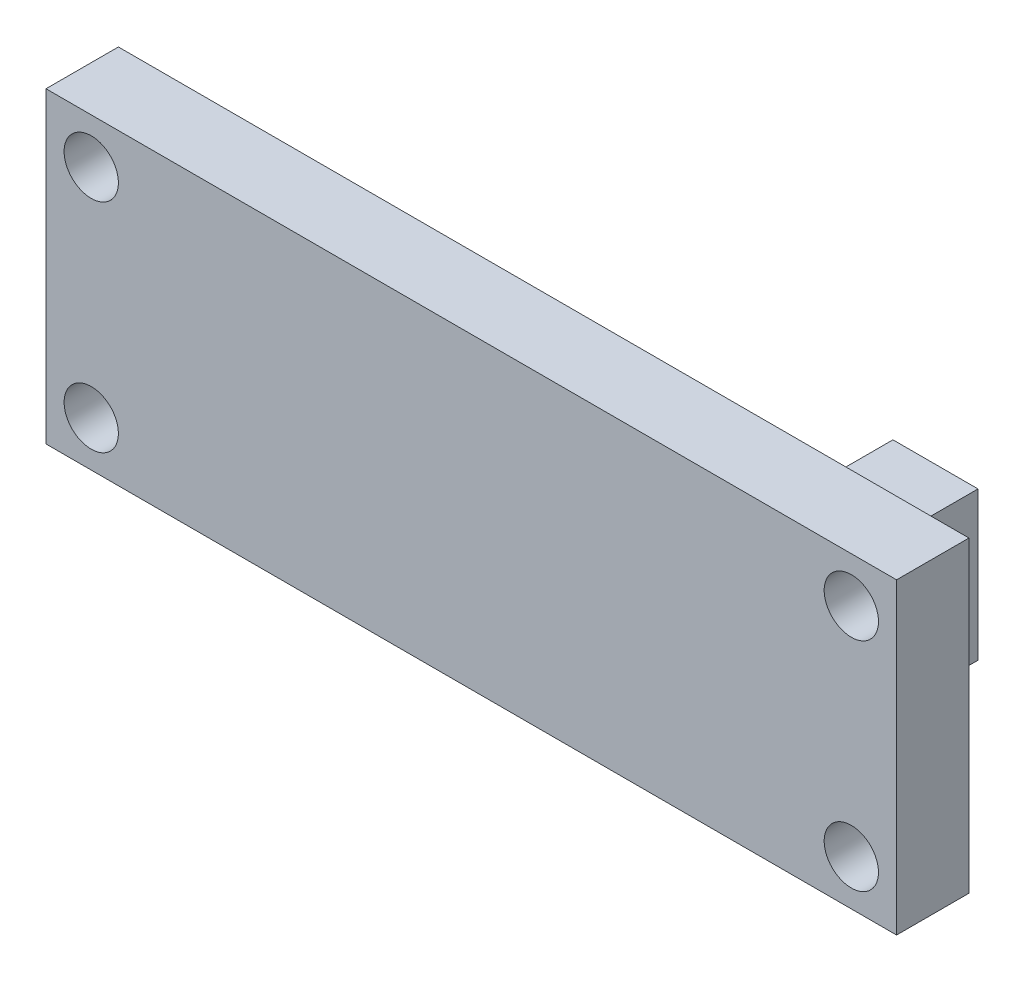
ISO-10303-21;
HEADER;
FILE_DESCRIPTION(('STEP AP214'),'2;1');
FILE_NAME('part.step','',(''),(''),'','','');
FILE_SCHEMA(('AUTOMOTIVE_DESIGN { 1 0 10303 214 1 1 1 1 }'));
ENDSEC;
DATA;
#1=APPLICATION_CONTEXT('core data for automotive mechanical design processes');
#2=APPLICATION_PROTOCOL_DEFINITION('international standard','automotive_design',2000,#1);
#3=PRODUCT_CONTEXT('',#1,'mechanical');
#4=PRODUCT('Part','Part','',(#3));
#5=PRODUCT_RELATED_PRODUCT_CATEGORY('part','',(#4));
#6=PRODUCT_DEFINITION_FORMATION('','',#4);
#7=PRODUCT_DEFINITION_CONTEXT('part definition',#1,'design');
#8=PRODUCT_DEFINITION('design','',#6,#7);
#9=PRODUCT_DEFINITION_SHAPE('','',#8);
#10=(LENGTH_UNIT() NAMED_UNIT(*) SI_UNIT(.MILLI.,.METRE.));
#11=(NAMED_UNIT(*) PLANE_ANGLE_UNIT() SI_UNIT($,.RADIAN.));
#12=(NAMED_UNIT(*) SI_UNIT($,.STERADIAN.) SOLID_ANGLE_UNIT());
#13=UNCERTAINTY_MEASURE_WITH_UNIT(LENGTH_MEASURE(1.E-05),#10,'distance_accuracy_value','');
#14=(GEOMETRIC_REPRESENTATION_CONTEXT(3) GLOBAL_UNCERTAINTY_ASSIGNED_CONTEXT((#13)) GLOBAL_UNIT_ASSIGNED_CONTEXT((#10,
#11,#12)) REPRESENTATION_CONTEXT('',''));
#15=CARTESIAN_POINT('',(0.,0.,0.));
#16=DIRECTION('',(0.,0.,1.));
#17=DIRECTION('',(1.,0.,0.));
#18=AXIS2_PLACEMENT_3D('',#15,#16,#17);
#19=CARTESIAN_POINT('',(0.,0.,0.));
#20=DIRECTION('',(0.,0.,1.));
#21=DIRECTION('',(1.,0.,0.));
#22=AXIS2_PLACEMENT_3D('',#19,#20,#21);
#23=PLANE('',#22);
#24=DIRECTION('',(0.,-1.,0.));
#25=VECTOR('',#24,1.);
#26=CARTESIAN_POINT('',(-47.,17.,0.));
#27=LINE('',#26,#25);
#28=CARTESIAN_POINT('',(-47.,17.,0.));
#29=VERTEX_POINT('',#28);
#30=CARTESIAN_POINT('',(-47.,0.,0.));
#31=VERTEX_POINT('',#30);
#32=EDGE_CURVE('E145',#29,#31,#27,.T.);
#33=ORIENTED_EDGE('',*,*,#32,.F.);
#34=DIRECTION('',(-1.,0.,0.));
#35=VECTOR('',#34,1.);
#36=CARTESIAN_POINT('',(-47.,17.,0.));
#37=LINE('',#36,#35);
#38=CARTESIAN_POINT('',(0.,17.,0.));
#39=VERTEX_POINT('',#38);
#40=EDGE_CURVE('E152',#39,#29,#37,.T.);
#41=ORIENTED_EDGE('',*,*,#40,.F.);
#42=DIRECTION('',(0.,1.,0.));
#43=VECTOR('',#42,1.);
#44=CARTESIAN_POINT('',(0.,17.,0.));
#45=LINE('',#44,#43);
#46=CARTESIAN_POINT('',(0.,0.,0.));
#47=VERTEX_POINT('',#46);
#48=EDGE_CURVE('E163',#47,#39,#45,.T.);
#49=ORIENTED_EDGE('',*,*,#48,.F.);
#50=DIRECTION('',(1.,0.,0.));
#51=VECTOR('',#50,1.);
#52=CARTESIAN_POINT('',(-47.,0.,0.));
#53=LINE('',#52,#51);
#54=EDGE_CURVE('E161',#31,#47,#53,.T.);
#55=ORIENTED_EDGE('',*,*,#54,.F.);
#56=EDGE_LOOP('',(#33,#41,#49,#55));
#57=FACE_BOUND('',#56,.T.);
#58=CARTESIAN_POINT('',(-2.5,14.5,0.));
#59=DIRECTION('',(0.,0.,1.));
#60=DIRECTION('',(1.,0.,0.));
#61=AXIS2_PLACEMENT_3D('',#58,#59,#60);
#62=CIRCLE('',#61,1.5);
#63=CARTESIAN_POINT('',(-1.,14.5,0.));
#64=VERTEX_POINT('',#63);
#65=EDGE_CURVE('E142',#64,#64,#62,.T.);
#66=ORIENTED_EDGE('',*,*,#65,.T.);
#67=EDGE_LOOP('',(#66));
#68=FACE_BOUND('',#67,.T.);
#69=CARTESIAN_POINT('',(-44.5,2.5,0.));
#70=DIRECTION('',(0.,0.,1.));
#71=DIRECTION('',(1.,0.,0.));
#72=AXIS2_PLACEMENT_3D('',#69,#70,#71);
#73=CIRCLE('',#72,1.5);
#74=CARTESIAN_POINT('',(-43.,2.5,0.));
#75=VERTEX_POINT('',#74);
#76=EDGE_CURVE('E121',#75,#75,#73,.T.);
#77=ORIENTED_EDGE('',*,*,#76,.T.);
#78=EDGE_LOOP('',(#77));
#79=FACE_BOUND('',#78,.T.);
#80=CARTESIAN_POINT('',(-44.5,14.5,0.));
#81=DIRECTION('',(0.,0.,1.));
#82=DIRECTION('',(1.,0.,0.));
#83=AXIS2_PLACEMENT_3D('',#80,#81,#82);
#84=CIRCLE('',#83,1.5);
#85=CARTESIAN_POINT('',(-43.,14.5,0.));
#86=VERTEX_POINT('',#85);
#87=EDGE_CURVE('E137',#86,#86,#84,.T.);
#88=ORIENTED_EDGE('',*,*,#87,.T.);
#89=EDGE_LOOP('',(#88));
#90=FACE_BOUND('',#89,.T.);
#91=CARTESIAN_POINT('',(-2.5,2.5,0.));
#92=DIRECTION('',(0.,0.,1.));
#93=DIRECTION('',(1.,0.,0.));
#94=AXIS2_PLACEMENT_3D('',#91,#92,#93);
#95=CIRCLE('',#94,1.5);
#96=CARTESIAN_POINT('',(-1.,2.5,0.));
#97=VERTEX_POINT('',#96);
#98=EDGE_CURVE('E130',#97,#97,#95,.T.);
#99=ORIENTED_EDGE('',*,*,#98,.T.);
#100=EDGE_LOOP('',(#99));
#101=FACE_BOUND('',#100,.T.);
#102=DIRECTION('',(0.,-1.,0.));
#103=VECTOR('',#102,1.);
#104=CARTESIAN_POINT('',(-6.5,12.6,0.));
#105=LINE('',#104,#103);
#106=CARTESIAN_POINT('',(-6.5,12.6,0.));
#107=VERTEX_POINT('',#106);
#108=CARTESIAN_POINT('',(-6.5,4.4,0.));
#109=VERTEX_POINT('',#108);
#110=EDGE_CURVE('E117',#107,#109,#105,.T.);
#111=ORIENTED_EDGE('',*,*,#110,.F.);
#112=DIRECTION('',(1.,0.,0.));
#113=VECTOR('',#112,1.);
#114=CARTESIAN_POINT('',(-6.5,12.6,0.));
#115=LINE('',#114,#113);
#116=CARTESIAN_POINT('',(-11.2,12.6,0.));
#117=VERTEX_POINT('',#116);
#118=EDGE_CURVE('E114',#117,#107,#115,.T.);
#119=ORIENTED_EDGE('',*,*,#118,.F.);
#120=DIRECTION('',(0.,1.,0.));
#121=VECTOR('',#120,1.);
#122=CARTESIAN_POINT('',(-11.2,12.6,0.));
#123=LINE('',#122,#121);
#124=CARTESIAN_POINT('',(-11.2,4.4,0.));
#125=VERTEX_POINT('',#124);
#126=EDGE_CURVE('E52',#125,#117,#123,.T.);
#127=ORIENTED_EDGE('',*,*,#126,.F.);
#128=DIRECTION('',(-1.,0.,0.));
#129=VECTOR('',#128,1.);
#130=CARTESIAN_POINT('',(-6.5,4.4,0.));
#131=LINE('',#130,#129);
#132=EDGE_CURVE('E47',#109,#125,#131,.T.);
#133=ORIENTED_EDGE('',*,*,#132,.F.);
#134=EDGE_LOOP('',(#111,#119,#127,#133));
#135=FACE_BOUND('',#134,.T.);
#136=ADVANCED_FACE('F32',(#57,#68,#79,#90,#101,#135),#23,.F.);
#137=CARTESIAN_POINT('',(-47.,17.,4.));
#138=DIRECTION('',(1.,0.,0.));
#139=DIRECTION('',(0.,0.,-1.));
#140=AXIS2_PLACEMENT_3D('',#137,#138,#139);
#141=PLANE('',#140);
#142=ORIENTED_EDGE('',*,*,#32,.T.);
#143=DIRECTION('',(0.,0.,-1.));
#144=VECTOR('',#143,1.);
#145=CARTESIAN_POINT('',(-47.,0.,4.));
#146=LINE('',#145,#144);
#147=CARTESIAN_POINT('',(-47.,0.,4.));
#148=VERTEX_POINT('',#147);
#149=EDGE_CURVE('E11',#148,#31,#146,.T.);
#150=ORIENTED_EDGE('',*,*,#149,.F.);
#151=DIRECTION('',(0.,-1.,0.));
#152=VECTOR('',#151,1.);
#153=CARTESIAN_POINT('',(-47.,17.,4.));
#154=LINE('',#153,#152);
#155=CARTESIAN_POINT('',(-47.,17.,4.));
#156=VERTEX_POINT('',#155);
#157=EDGE_CURVE('E148',#156,#148,#154,.T.);
#158=ORIENTED_EDGE('',*,*,#157,.F.);
#159=DIRECTION('',(0.,0.,-1.));
#160=VECTOR('',#159,1.);
#161=CARTESIAN_POINT('',(-47.,17.,4.));
#162=LINE('',#161,#160);
#163=EDGE_CURVE('E158',#156,#29,#162,.T.);
#164=ORIENTED_EDGE('',*,*,#163,.T.);
#165=EDGE_LOOP('',(#142,#150,#158,#164));
#166=FACE_BOUND('',#165,.T.);
#167=ADVANCED_FACE('F34',(#166),#141,.F.);
#168=CARTESIAN_POINT('',(-47.,0.,4.));
#169=DIRECTION('',(0.,1.,0.));
#170=DIRECTION('',(-1.,0.,0.));
#171=AXIS2_PLACEMENT_3D('',#168,#169,#170);
#172=PLANE('',#171);
#173=ORIENTED_EDGE('',*,*,#54,.T.);
#174=DIRECTION('',(0.,0.,-1.));
#175=VECTOR('',#174,1.);
#176=CARTESIAN_POINT('',(0.,0.,4.));
#177=LINE('',#176,#175);
#178=CARTESIAN_POINT('',(0.,0.,4.));
#179=VERTEX_POINT('',#178);
#180=EDGE_CURVE('E40',#179,#47,#177,.T.);
#181=ORIENTED_EDGE('',*,*,#180,.F.);
#182=DIRECTION('',(1.,0.,0.));
#183=VECTOR('',#182,1.);
#184=CARTESIAN_POINT('',(-47.,0.,4.));
#185=LINE('',#184,#183);
#186=EDGE_CURVE('E151',#148,#179,#185,.T.);
#187=ORIENTED_EDGE('',*,*,#186,.F.);
#188=ORIENTED_EDGE('',*,*,#149,.T.);
#189=EDGE_LOOP('',(#173,#181,#187,#188));
#190=FACE_BOUND('',#189,.T.);
#191=ADVANCED_FACE('F191',(#190),#172,.F.);
#192=CARTESIAN_POINT('',(0.,17.,4.));
#193=DIRECTION('',(-1.,0.,0.));
#194=DIRECTION('',(0.,-1.,0.));
#195=AXIS2_PLACEMENT_3D('',#192,#193,#194);
#196=PLANE('',#195);
#197=ORIENTED_EDGE('',*,*,#48,.T.);
#198=DIRECTION('',(0.,0.,-1.));
#199=VECTOR('',#198,1.);
#200=CARTESIAN_POINT('',(0.,17.,4.));
#201=LINE('',#200,#199);
#202=CARTESIAN_POINT('',(0.,17.,4.));
#203=VERTEX_POINT('',#202);
#204=EDGE_CURVE('E168',#203,#39,#201,.T.);
#205=ORIENTED_EDGE('',*,*,#204,.F.);
#206=DIRECTION('',(0.,1.,0.));
#207=VECTOR('',#206,1.);
#208=CARTESIAN_POINT('',(0.,17.,4.));
#209=LINE('',#208,#207);
#210=EDGE_CURVE('E154',#179,#203,#209,.T.);
#211=ORIENTED_EDGE('',*,*,#210,.F.);
#212=ORIENTED_EDGE('',*,*,#180,.T.);
#213=EDGE_LOOP('',(#197,#205,#211,#212));
#214=FACE_BOUND('',#213,.T.);
#215=ADVANCED_FACE('F175',(#214),#196,.F.);
#216=CARTESIAN_POINT('',(-47.,17.,4.));
#217=DIRECTION('',(0.,-1.,0.));
#218=DIRECTION('',(0.,0.,-1.));
#219=AXIS2_PLACEMENT_3D('',#216,#217,#218);
#220=PLANE('',#219);
#221=ORIENTED_EDGE('',*,*,#40,.T.);
#222=ORIENTED_EDGE('',*,*,#163,.F.);
#223=DIRECTION('',(-1.,0.,0.));
#224=VECTOR('',#223,1.);
#225=CARTESIAN_POINT('',(-47.,17.,4.));
#226=LINE('',#225,#224);
#227=EDGE_CURVE('E156',#203,#156,#226,.T.);
#228=ORIENTED_EDGE('',*,*,#227,.F.);
#229=ORIENTED_EDGE('',*,*,#204,.T.);
#230=EDGE_LOOP('',(#221,#222,#228,#229));
#231=FACE_BOUND('',#230,.T.);
#232=ADVANCED_FACE('F184',(#231),#220,.F.);
#233=CARTESIAN_POINT('',(0.,0.,4.));
#234=DIRECTION('',(0.,0.,1.));
#235=DIRECTION('',(1.,0.,0.));
#236=AXIS2_PLACEMENT_3D('',#233,#234,#235);
#237=PLANE('',#236);
#238=CARTESIAN_POINT('',(-2.5,2.5,4.));
#239=DIRECTION('',(0.,0.,1.));
#240=DIRECTION('',(1.,0.,0.));
#241=AXIS2_PLACEMENT_3D('',#238,#239,#240);
#242=CIRCLE('',#241,1.5);
#243=CARTESIAN_POINT('',(-1.,2.5,4.));
#244=VERTEX_POINT('',#243);
#245=EDGE_CURVE('E134',#244,#244,#242,.T.);
#246=ORIENTED_EDGE('',*,*,#245,.F.);
#247=EDGE_LOOP('',(#246));
#248=FACE_BOUND('',#247,.T.);
#249=CARTESIAN_POINT('',(-44.5,14.5,4.));
#250=DIRECTION('',(0.,0.,1.));
#251=DIRECTION('',(1.,0.,0.));
#252=AXIS2_PLACEMENT_3D('',#249,#250,#251);
#253=CIRCLE('',#252,1.5);
#254=CARTESIAN_POINT('',(-43.,14.5,4.));
#255=VERTEX_POINT('',#254);
#256=EDGE_CURVE('E128',#255,#255,#253,.T.);
#257=ORIENTED_EDGE('',*,*,#256,.F.);
#258=EDGE_LOOP('',(#257));
#259=FACE_BOUND('',#258,.T.);
#260=CARTESIAN_POINT('',(-44.5,2.5,4.));
#261=DIRECTION('',(0.,0.,1.));
#262=DIRECTION('',(1.,0.,0.));
#263=AXIS2_PLACEMENT_3D('',#260,#261,#262);
#264=CIRCLE('',#263,1.5);
#265=CARTESIAN_POINT('',(-43.,2.5,4.));
#266=VERTEX_POINT('',#265);
#267=EDGE_CURVE('E118',#266,#266,#264,.T.);
#268=ORIENTED_EDGE('',*,*,#267,.F.);
#269=EDGE_LOOP('',(#268));
#270=FACE_BOUND('',#269,.T.);
#271=CARTESIAN_POINT('',(-2.5,14.5,4.));
#272=DIRECTION('',(0.,0.,1.));
#273=DIRECTION('',(1.,0.,0.));
#274=AXIS2_PLACEMENT_3D('',#271,#272,#273);
#275=CIRCLE('',#274,1.5);
#276=CARTESIAN_POINT('',(-1.,14.5,4.));
#277=VERTEX_POINT('',#276);
#278=EDGE_CURVE('E133',#277,#277,#275,.T.);
#279=ORIENTED_EDGE('',*,*,#278,.F.);
#280=EDGE_LOOP('',(#279));
#281=FACE_BOUND('',#280,.T.);
#282=ORIENTED_EDGE('',*,*,#157,.T.);
#283=ORIENTED_EDGE('',*,*,#186,.T.);
#284=ORIENTED_EDGE('',*,*,#210,.T.);
#285=ORIENTED_EDGE('',*,*,#227,.T.);
#286=EDGE_LOOP('',(#282,#283,#284,#285));
#287=FACE_BOUND('',#286,.T.);
#288=ADVANCED_FACE('F190',(#248,#259,#270,#281,#287),#237,.T.);
#289=CARTESIAN_POINT('',(-2.5,14.5,0.));
#290=DIRECTION('',(0.,0.,1.));
#291=DIRECTION('',(1.,0.,0.));
#292=AXIS2_PLACEMENT_3D('',#289,#290,#291);
#293=CYLINDRICAL_SURFACE('',#292,1.5);
#294=ORIENTED_EDGE('',*,*,#65,.F.);
#295=EDGE_LOOP('',(#294));
#296=FACE_BOUND('',#295,.T.);
#297=ORIENTED_EDGE('',*,*,#278,.T.);
#298=EDGE_LOOP('',(#297));
#299=FACE_BOUND('',#298,.T.);
#300=ADVANCED_FACE('F209',(#296,#299),#293,.F.);
#301=CARTESIAN_POINT('',(-44.5,2.5,0.));
#302=DIRECTION('',(0.,0.,1.));
#303=DIRECTION('',(1.,0.,0.));
#304=AXIS2_PLACEMENT_3D('',#301,#302,#303);
#305=CYLINDRICAL_SURFACE('',#304,1.5);
#306=ORIENTED_EDGE('',*,*,#76,.F.);
#307=EDGE_LOOP('',(#306));
#308=FACE_BOUND('',#307,.T.);
#309=ORIENTED_EDGE('',*,*,#267,.T.);
#310=EDGE_LOOP('',(#309));
#311=FACE_BOUND('',#310,.T.);
#312=ADVANCED_FACE('F214',(#308,#311),#305,.F.);
#313=CARTESIAN_POINT('',(-44.5,14.5,0.));
#314=DIRECTION('',(0.,0.,1.));
#315=DIRECTION('',(1.,0.,0.));
#316=AXIS2_PLACEMENT_3D('',#313,#314,#315);
#317=CYLINDRICAL_SURFACE('',#316,1.5);
#318=ORIENTED_EDGE('',*,*,#87,.F.);
#319=EDGE_LOOP('',(#318));
#320=FACE_BOUND('',#319,.T.);
#321=ORIENTED_EDGE('',*,*,#256,.T.);
#322=EDGE_LOOP('',(#321));
#323=FACE_BOUND('',#322,.T.);
#324=ADVANCED_FACE('F226',(#320,#323),#317,.F.);
#325=CARTESIAN_POINT('',(-2.5,2.5,0.));
#326=DIRECTION('',(0.,0.,1.));
#327=DIRECTION('',(1.,0.,0.));
#328=AXIS2_PLACEMENT_3D('',#325,#326,#327);
#329=CYLINDRICAL_SURFACE('',#328,1.5);
#330=ORIENTED_EDGE('',*,*,#98,.F.);
#331=EDGE_LOOP('',(#330));
#332=FACE_BOUND('',#331,.T.);
#333=ORIENTED_EDGE('',*,*,#245,.T.);
#334=EDGE_LOOP('',(#333));
#335=FACE_BOUND('',#334,.T.);
#336=ADVANCED_FACE('F232',(#332,#335),#329,.F.);
#337=CARTESIAN_POINT('',(-6.5,12.6,-7.));
#338=DIRECTION('',(-1.,0.,0.));
#339=DIRECTION('',(0.,-1.,0.));
#340=AXIS2_PLACEMENT_3D('',#337,#338,#339);
#341=PLANE('',#340);
#342=ORIENTED_EDGE('',*,*,#110,.T.);
#343=DIRECTION('',(0.,0.,1.));
#344=VECTOR('',#343,1.);
#345=CARTESIAN_POINT('',(-6.5,4.4,-7.));
#346=LINE('',#345,#344);
#347=CARTESIAN_POINT('',(-6.5,4.4,-7.));
#348=VERTEX_POINT('',#347);
#349=EDGE_CURVE('E98',#348,#109,#346,.T.);
#350=ORIENTED_EDGE('',*,*,#349,.F.);
#351=DIRECTION('',(0.,-1.,0.));
#352=VECTOR('',#351,1.);
#353=CARTESIAN_POINT('',(-6.5,12.6,-7.));
#354=LINE('',#353,#352);
#355=CARTESIAN_POINT('',(-6.5,12.6,-7.));
#356=VERTEX_POINT('',#355);
#357=EDGE_CURVE('E105',#356,#348,#354,.T.);
#358=ORIENTED_EDGE('',*,*,#357,.F.);
#359=DIRECTION('',(0.,0.,1.));
#360=VECTOR('',#359,1.);
#361=CARTESIAN_POINT('',(-6.5,12.6,-7.));
#362=LINE('',#361,#360);
#363=EDGE_CURVE('E252',#356,#107,#362,.T.);
#364=ORIENTED_EDGE('',*,*,#363,.T.);
#365=EDGE_LOOP('',(#342,#350,#358,#364));
#366=FACE_BOUND('',#365,.T.);
#367=ADVANCED_FACE('F116',(#366),#341,.F.);
#368=CARTESIAN_POINT('',(-6.5,4.4,-7.));
#369=DIRECTION('',(0.,1.,0.));
#370=DIRECTION('',(0.,0.,1.));
#371=AXIS2_PLACEMENT_3D('',#368,#369,#370);
#372=PLANE('',#371);
#373=ORIENTED_EDGE('',*,*,#132,.T.);
#374=DIRECTION('',(0.,0.,1.));
#375=VECTOR('',#374,1.);
#376=CARTESIAN_POINT('',(-11.2,4.4,-7.));
#377=LINE('',#376,#375);
#378=CARTESIAN_POINT('',(-11.2,4.4,-7.));
#379=VERTEX_POINT('',#378);
#380=EDGE_CURVE('E101',#379,#125,#377,.T.);
#381=ORIENTED_EDGE('',*,*,#380,.F.);
#382=DIRECTION('',(-1.,0.,0.));
#383=VECTOR('',#382,1.);
#384=CARTESIAN_POINT('',(-6.5,4.4,-7.));
#385=LINE('',#384,#383);
#386=EDGE_CURVE('E94',#348,#379,#385,.T.);
#387=ORIENTED_EDGE('',*,*,#386,.F.);
#388=ORIENTED_EDGE('',*,*,#349,.T.);
#389=EDGE_LOOP('',(#373,#381,#387,#388));
#390=FACE_BOUND('',#389,.T.);
#391=ADVANCED_FACE('F96',(#390),#372,.F.);
#392=CARTESIAN_POINT('',(-11.2,12.6,-7.));
#393=DIRECTION('',(1.,0.,0.));
#394=DIRECTION('',(0.,1.,0.));
#395=AXIS2_PLACEMENT_3D('',#392,#393,#394);
#396=PLANE('',#395);
#397=ORIENTED_EDGE('',*,*,#126,.T.);
#398=DIRECTION('',(0.,0.,1.));
#399=VECTOR('',#398,1.);
#400=CARTESIAN_POINT('',(-11.2,12.6,-7.));
#401=LINE('',#400,#399);
#402=CARTESIAN_POINT('',(-11.2,12.6,-7.));
#403=VERTEX_POINT('',#402);
#404=EDGE_CURVE('E123',#403,#117,#401,.T.);
#405=ORIENTED_EDGE('',*,*,#404,.F.);
#406=DIRECTION('',(0.,1.,0.));
#407=VECTOR('',#406,1.);
#408=CARTESIAN_POINT('',(-11.2,12.6,-7.));
#409=LINE('',#408,#407);
#410=EDGE_CURVE('E104',#379,#403,#409,.T.);
#411=ORIENTED_EDGE('',*,*,#410,.F.);
#412=ORIENTED_EDGE('',*,*,#380,.T.);
#413=EDGE_LOOP('',(#397,#405,#411,#412));
#414=FACE_BOUND('',#413,.T.);
#415=ADVANCED_FACE('F261',(#414),#396,.F.);
#416=CARTESIAN_POINT('',(-6.5,12.6,-7.));
#417=DIRECTION('',(0.,-1.,0.));
#418=DIRECTION('',(1.,0.,0.));
#419=AXIS2_PLACEMENT_3D('',#416,#417,#418);
#420=PLANE('',#419);
#421=ORIENTED_EDGE('',*,*,#118,.T.);
#422=ORIENTED_EDGE('',*,*,#363,.F.);
#423=DIRECTION('',(1.,0.,0.));
#424=VECTOR('',#423,1.);
#425=CARTESIAN_POINT('',(-6.5,12.6,-7.));
#426=LINE('',#425,#424);
#427=EDGE_CURVE('E110',#403,#356,#426,.T.);
#428=ORIENTED_EDGE('',*,*,#427,.F.);
#429=ORIENTED_EDGE('',*,*,#404,.T.);
#430=EDGE_LOOP('',(#421,#422,#428,#429));
#431=FACE_BOUND('',#430,.T.);
#432=ADVANCED_FACE('F251',(#431),#420,.F.);
#433=CARTESIAN_POINT('',(0.,0.,-7.));
#434=DIRECTION('',(0.,0.,-1.));
#435=DIRECTION('',(-1.,0.,0.));
#436=AXIS2_PLACEMENT_3D('',#433,#434,#435);
#437=PLANE('',#436);
#438=ORIENTED_EDGE('',*,*,#357,.T.);
#439=ORIENTED_EDGE('',*,*,#386,.T.);
#440=ORIENTED_EDGE('',*,*,#410,.T.);
#441=ORIENTED_EDGE('',*,*,#427,.T.);
#442=EDGE_LOOP('',(#438,#439,#440,#441));
#443=FACE_BOUND('',#442,.T.);
#444=ADVANCED_FACE('F108',(#443),#437,.T.);
#445=CLOSED_SHELL('',(#136,#167,#191,#215,#232,#288,#300,#312,#324,#336,#367,#391,#415,#432,#444));
#446=MANIFOLD_SOLID_BREP('B2',#445);
#447=ADVANCED_BREP_SHAPE_REPRESENTATION('',(#18,#446),#14);
#448=SHAPE_DEFINITION_REPRESENTATION(#9,#447);
ENDSEC;
END-ISO-10303-21;
